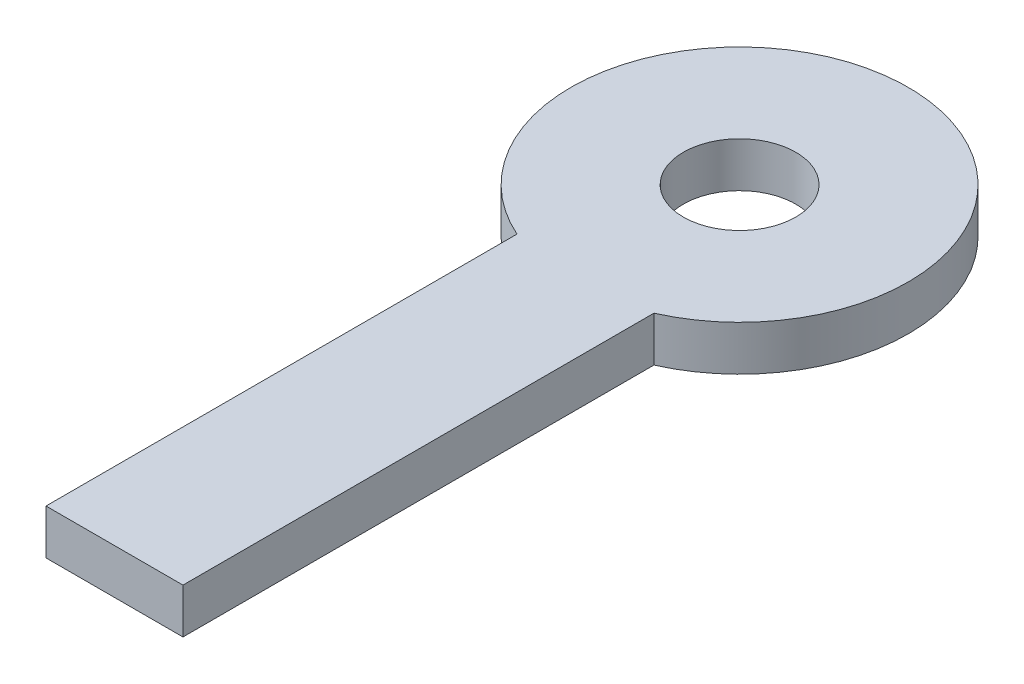
ISO-10303-21;
HEADER;
FILE_DESCRIPTION(('STEP AP214'),'2;1');
FILE_NAME('part.step','',(''),(''),'','','');
FILE_SCHEMA(('AUTOMOTIVE_DESIGN { 1 0 10303 214 1 1 1 1 }'));
ENDSEC;
DATA;
#1=APPLICATION_CONTEXT('core data for automotive mechanical design processes');
#2=APPLICATION_PROTOCOL_DEFINITION('international standard','automotive_design',2000,#1);
#3=PRODUCT_CONTEXT('',#1,'mechanical');
#4=PRODUCT('Part','Part','',(#3));
#5=PRODUCT_RELATED_PRODUCT_CATEGORY('part','',(#4));
#6=PRODUCT_DEFINITION_FORMATION('','',#4);
#7=PRODUCT_DEFINITION_CONTEXT('part definition',#1,'design');
#8=PRODUCT_DEFINITION('design','',#6,#7);
#9=PRODUCT_DEFINITION_SHAPE('','',#8);
#10=(LENGTH_UNIT() NAMED_UNIT(*) SI_UNIT(.MILLI.,.METRE.));
#11=(NAMED_UNIT(*) PLANE_ANGLE_UNIT() SI_UNIT($,.RADIAN.));
#12=(NAMED_UNIT(*) SI_UNIT($,.STERADIAN.) SOLID_ANGLE_UNIT());
#13=UNCERTAINTY_MEASURE_WITH_UNIT(LENGTH_MEASURE(1.E-05),#10,'distance_accuracy_value','');
#14=(GEOMETRIC_REPRESENTATION_CONTEXT(3) GLOBAL_UNCERTAINTY_ASSIGNED_CONTEXT((#13)) GLOBAL_UNIT_ASSIGNED_CONTEXT((#10,
#11,#12)) REPRESENTATION_CONTEXT('',''));
#15=CARTESIAN_POINT('',(0.,0.,0.));
#16=DIRECTION('',(0.,0.,1.));
#17=DIRECTION('',(1.,0.,0.));
#18=AXIS2_PLACEMENT_3D('',#15,#16,#17);
#19=CARTESIAN_POINT('',(0.,10.16,0.));
#20=DIRECTION('',(0.,1.,0.));
#21=DIRECTION('',(0.,0.,1.));
#22=AXIS2_PLACEMENT_3D('',#19,#20,#21);
#23=PLANE('',#22);
#24=CARTESIAN_POINT('',(0.,10.16,0.));
#25=DIRECTION('',(0.,1.,0.));
#26=DIRECTION('',(0.,0.,1.));
#27=AXIS2_PLACEMENT_3D('',#24,#25,#26);
#28=CIRCLE('',#27,38.1);
#29=CARTESIAN_POINT('',(15.4711335855293,10.16,34.817438526961));
#30=VERTEX_POINT('',#29);
#31=CARTESIAN_POINT('',(-15.4711335855293,10.16,34.817438526961));
#32=VERTEX_POINT('',#31);
#33=EDGE_CURVE('E92',#30,#32,#28,.T.);
#34=ORIENTED_EDGE('',*,*,#33,.T.);
#35=DIRECTION('',(0.,0.,1.));
#36=VECTOR('',#35,1.);
#37=CARTESIAN_POINT('',(-15.4711335855293,10.16,34.817438526961));
#38=LINE('',#37,#36);
#39=CARTESIAN_POINT('',(-15.4711335855293,10.16,141.218475004962));
#40=VERTEX_POINT('',#39);
#41=EDGE_CURVE('E87',#32,#40,#38,.T.);
#42=ORIENTED_EDGE('',*,*,#41,.T.);
#43=DIRECTION('',(1.,0.,0.));
#44=VECTOR('',#43,1.);
#45=CARTESIAN_POINT('',(-15.4711335855293,10.16,141.218475004962));
#46=LINE('',#45,#44);
#47=CARTESIAN_POINT('',(15.4711335855293,10.16,141.218475004962));
#48=VERTEX_POINT('',#47);
#49=EDGE_CURVE('E90',#40,#48,#46,.T.);
#50=ORIENTED_EDGE('',*,*,#49,.T.);
#51=DIRECTION('',(0.,0.,-1.));
#52=VECTOR('',#51,1.);
#53=CARTESIAN_POINT('',(15.4711335855293,10.16,34.817438526961));
#54=LINE('',#53,#52);
#55=EDGE_CURVE('E57',#48,#30,#54,.T.);
#56=ORIENTED_EDGE('',*,*,#55,.T.);
#57=EDGE_LOOP('',(#34,#42,#50,#56));
#58=FACE_BOUND('',#57,.T.);
#59=CARTESIAN_POINT('',(0.,10.16,0.));
#60=DIRECTION('',(0.,1.,0.));
#61=DIRECTION('',(0.,0.,1.));
#62=AXIS2_PLACEMENT_3D('',#59,#60,#61);
#63=CIRCLE('',#62,12.7);
#64=CARTESIAN_POINT('',(0.,10.16,12.7));
#65=VERTEX_POINT('',#64);
#66=EDGE_CURVE('E112',#65,#65,#63,.T.);
#67=ORIENTED_EDGE('',*,*,#66,.F.);
#68=EDGE_LOOP('',(#67));
#69=FACE_BOUND('',#68,.T.);
#70=ADVANCED_FACE('F39',(#58,#69),#23,.T.);
#71=CARTESIAN_POINT('',(0.,0.,0.));
#72=DIRECTION('',(0.,1.,0.));
#73=DIRECTION('',(0.,0.,1.));
#74=AXIS2_PLACEMENT_3D('',#71,#72,#73);
#75=PLANE('',#74);
#76=CARTESIAN_POINT('',(0.,0.,0.));
#77=DIRECTION('',(0.,1.,0.));
#78=DIRECTION('',(0.,0.,1.));
#79=AXIS2_PLACEMENT_3D('',#76,#77,#78);
#80=CIRCLE('',#79,38.1);
#81=CARTESIAN_POINT('',(15.4711335855293,0.,34.817438526961));
#82=VERTEX_POINT('',#81);
#83=CARTESIAN_POINT('',(-15.4711335855293,0.,34.817438526961));
#84=VERTEX_POINT('',#83);
#85=EDGE_CURVE('E108',#82,#84,#80,.T.);
#86=ORIENTED_EDGE('',*,*,#85,.F.);
#87=DIRECTION('',(0.,0.,-1.));
#88=VECTOR('',#87,1.);
#89=CARTESIAN_POINT('',(15.4711335855293,0.,34.817438526961));
#90=LINE('',#89,#88);
#91=CARTESIAN_POINT('',(15.4711335855293,0.,141.218475004962));
#92=VERTEX_POINT('',#91);
#93=EDGE_CURVE('E80',#92,#82,#90,.T.);
#94=ORIENTED_EDGE('',*,*,#93,.F.);
#95=DIRECTION('',(1.,0.,0.));
#96=VECTOR('',#95,1.);
#97=CARTESIAN_POINT('',(-15.4711335855293,0.,141.218475004962));
#98=LINE('',#97,#96);
#99=CARTESIAN_POINT('',(-15.4711335855293,0.,141.218475004962));
#100=VERTEX_POINT('',#99);
#101=EDGE_CURVE('E74',#100,#92,#98,.T.);
#102=ORIENTED_EDGE('',*,*,#101,.F.);
#103=DIRECTION('',(0.,0.,1.));
#104=VECTOR('',#103,1.);
#105=CARTESIAN_POINT('',(-15.4711335855293,0.,34.817438526961));
#106=LINE('',#105,#104);
#107=EDGE_CURVE('E97',#84,#100,#106,.T.);
#108=ORIENTED_EDGE('',*,*,#107,.F.);
#109=EDGE_LOOP('',(#86,#94,#102,#108));
#110=FACE_BOUND('',#109,.T.);
#111=CARTESIAN_POINT('',(0.,0.,0.));
#112=DIRECTION('',(0.,1.,0.));
#113=DIRECTION('',(0.,0.,1.));
#114=AXIS2_PLACEMENT_3D('',#111,#112,#113);
#115=CIRCLE('',#114,12.7);
#116=CARTESIAN_POINT('',(0.,0.,12.7));
#117=VERTEX_POINT('',#116);
#118=EDGE_CURVE('E130',#117,#117,#115,.T.);
#119=ORIENTED_EDGE('',*,*,#118,.T.);
#120=EDGE_LOOP('',(#119));
#121=FACE_BOUND('',#120,.T.);
#122=ADVANCED_FACE('F125',(#110,#121),#75,.F.);
#123=CARTESIAN_POINT('',(0.,10.16,0.));
#124=DIRECTION('',(0.,-1.,0.));
#125=DIRECTION('',(0.,0.,-1.));
#126=AXIS2_PLACEMENT_3D('',#123,#124,#125);
#127=CYLINDRICAL_SURFACE('',#126,38.1);
#128=ORIENTED_EDGE('',*,*,#85,.T.);
#129=DIRECTION('',(0.,-1.,0.));
#130=VECTOR('',#129,1.);
#131=CARTESIAN_POINT('',(-15.4711335855293,10.16,34.817438526961));
#132=LINE('',#131,#130);
#133=EDGE_CURVE('E11',#32,#84,#132,.T.);
#134=ORIENTED_EDGE('',*,*,#133,.F.);
#135=ORIENTED_EDGE('',*,*,#33,.F.);
#136=DIRECTION('',(0.,-1.,0.));
#137=VECTOR('',#136,1.);
#138=CARTESIAN_POINT('',(15.4711335855293,10.16,34.817438526961));
#139=LINE('',#138,#137);
#140=EDGE_CURVE('E104',#30,#82,#139,.T.);
#141=ORIENTED_EDGE('',*,*,#140,.T.);
#142=EDGE_LOOP('',(#128,#134,#135,#141));
#143=FACE_BOUND('',#142,.T.);
#144=ADVANCED_FACE('F41',(#143),#127,.T.);
#145=CARTESIAN_POINT('',(-15.4711335855293,10.16,34.817438526961));
#146=DIRECTION('',(1.,0.,0.));
#147=DIRECTION('',(0.,0.,-1.));
#148=AXIS2_PLACEMENT_3D('',#145,#146,#147);
#149=PLANE('',#148);
#150=ORIENTED_EDGE('',*,*,#107,.T.);
#151=DIRECTION('',(0.,-1.,0.));
#152=VECTOR('',#151,1.);
#153=CARTESIAN_POINT('',(-15.4711335855293,10.16,141.218475004962));
#154=LINE('',#153,#152);
#155=EDGE_CURVE('E49',#40,#100,#154,.T.);
#156=ORIENTED_EDGE('',*,*,#155,.F.);
#157=ORIENTED_EDGE('',*,*,#41,.F.);
#158=ORIENTED_EDGE('',*,*,#133,.T.);
#159=EDGE_LOOP('',(#150,#156,#157,#158));
#160=FACE_BOUND('',#159,.T.);
#161=ADVANCED_FACE('F96',(#160),#149,.F.);
#162=CARTESIAN_POINT('',(-15.4711335855293,10.16,141.218475004962));
#163=DIRECTION('',(0.,0.,-1.));
#164=DIRECTION('',(-1.,0.,0.));
#165=AXIS2_PLACEMENT_3D('',#162,#163,#164);
#166=PLANE('',#165);
#167=ORIENTED_EDGE('',*,*,#101,.T.);
#168=DIRECTION('',(0.,-1.,0.));
#169=VECTOR('',#168,1.);
#170=CARTESIAN_POINT('',(15.4711335855293,10.16,141.218475004962));
#171=LINE('',#170,#169);
#172=EDGE_CURVE('E99',#48,#92,#171,.T.);
#173=ORIENTED_EDGE('',*,*,#172,.F.);
#174=ORIENTED_EDGE('',*,*,#49,.F.);
#175=ORIENTED_EDGE('',*,*,#155,.T.);
#176=EDGE_LOOP('',(#167,#173,#174,#175));
#177=FACE_BOUND('',#176,.T.);
#178=ADVANCED_FACE('F100',(#177),#166,.F.);
#179=CARTESIAN_POINT('',(15.4711335855293,10.16,34.817438526961));
#180=DIRECTION('',(-1.,0.,0.));
#181=DIRECTION('',(0.,0.,1.));
#182=AXIS2_PLACEMENT_3D('',#179,#180,#181);
#183=PLANE('',#182);
#184=ORIENTED_EDGE('',*,*,#93,.T.);
#185=ORIENTED_EDGE('',*,*,#140,.F.);
#186=ORIENTED_EDGE('',*,*,#55,.F.);
#187=ORIENTED_EDGE('',*,*,#172,.T.);
#188=EDGE_LOOP('',(#184,#185,#186,#187));
#189=FACE_BOUND('',#188,.T.);
#190=ADVANCED_FACE('F122',(#189),#183,.F.);
#191=CARTESIAN_POINT('',(0.,10.16,0.));
#192=DIRECTION('',(0.,-1.,0.));
#193=DIRECTION('',(0.,0.,-1.));
#194=AXIS2_PLACEMENT_3D('',#191,#192,#193);
#195=CYLINDRICAL_SURFACE('',#194,12.7);
#196=ORIENTED_EDGE('',*,*,#66,.T.);
#197=EDGE_LOOP('',(#196));
#198=FACE_BOUND('',#197,.T.);
#199=ORIENTED_EDGE('',*,*,#118,.F.);
#200=EDGE_LOOP('',(#199));
#201=FACE_BOUND('',#200,.T.);
#202=ADVANCED_FACE('F138',(#198,#201),#195,.F.);
#203=CLOSED_SHELL('',(#70,#122,#144,#161,#178,#190,#202));
#204=MANIFOLD_SOLID_BREP('B2',#203);
#205=ADVANCED_BREP_SHAPE_REPRESENTATION('',(#18,#204),#14);
#206=SHAPE_DEFINITION_REPRESENTATION(#9,#205);
ENDSEC;
END-ISO-10303-21;
